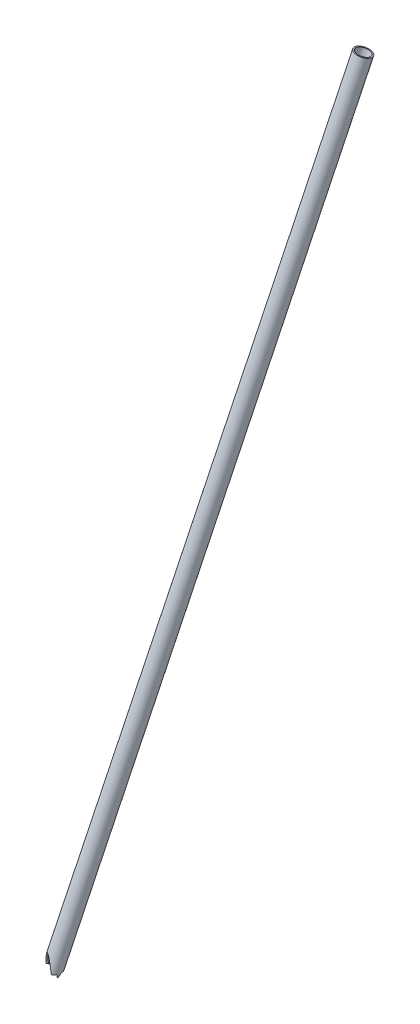
ISO-10303-21;
HEADER;
FILE_DESCRIPTION(('STEP AP214'),'2;1');
FILE_NAME('part.step','',(''),(''),'','','');
FILE_SCHEMA(('AUTOMOTIVE_DESIGN { 1 0 10303 214 1 1 1 1 }'));
ENDSEC;
DATA;
#1=APPLICATION_CONTEXT('core data for automotive mechanical design processes');
#2=APPLICATION_PROTOCOL_DEFINITION('international standard','automotive_design',2000,#1);
#3=PRODUCT_CONTEXT('',#1,'mechanical');
#4=PRODUCT('Part','Part','',(#3));
#5=PRODUCT_RELATED_PRODUCT_CATEGORY('part','',(#4));
#6=PRODUCT_DEFINITION_FORMATION('','',#4);
#7=PRODUCT_DEFINITION_CONTEXT('part definition',#1,'design');
#8=PRODUCT_DEFINITION('design','',#6,#7);
#9=PRODUCT_DEFINITION_SHAPE('','',#8);
#10=(LENGTH_UNIT() NAMED_UNIT(*) SI_UNIT(.MILLI.,.METRE.));
#11=(NAMED_UNIT(*) PLANE_ANGLE_UNIT() SI_UNIT($,.RADIAN.));
#12=(NAMED_UNIT(*) SI_UNIT($,.STERADIAN.) SOLID_ANGLE_UNIT());
#13=UNCERTAINTY_MEASURE_WITH_UNIT(LENGTH_MEASURE(1.E-05),#10,'distance_accuracy_value','');
#14=(GEOMETRIC_REPRESENTATION_CONTEXT(3) GLOBAL_UNCERTAINTY_ASSIGNED_CONTEXT((#13)) GLOBAL_UNIT_ASSIGNED_CONTEXT((#10,
#11,#12)) REPRESENTATION_CONTEXT('',''));
#15=CARTESIAN_POINT('',(0.,0.,0.));
#16=DIRECTION('',(0.,0.,1.));
#17=DIRECTION('',(1.,0.,0.));
#18=AXIS2_PLACEMENT_3D('',#15,#16,#17);
#19=CARTESIAN_POINT('',(-115.,920.,-1946.51325703663));
#20=DIRECTION('',(-0.140336447675245,-0.956366902675742,0.256257739239816));
#21=DIRECTION('',(0.,-0.258819045102517,-0.965925826289069));
#22=AXIS2_PLACEMENT_3D('',#19,#20,#21);
#23=CYLINDRICAL_SURFACE('',#22,7.90000000000002);
#24=CARTESIAN_POINT('',(-249.256500167691,3.02214321572415,-1708.9884626593));
#25=CARTESIAN_POINT('',(-249.036182368543,2.99789343579126,-1708.9819641937));
#26=CARTESIAN_POINT('',(-248.815767735897,2.97675560782215,-1708.96663661791));
#27=CARTESIAN_POINT('',(-248.376445132871,2.93978476053923,-1708.91814526736));
#28=CARTESIAN_POINT('',(-248.157537331688,2.92395232772737,-1708.88497952166));
#29=CARTESIAN_POINT('',(-247.722853153401,2.89689185007694,-1708.80081715776));
#30=CARTESIAN_POINT('',(-247.507077210988,2.88566443861308,-1708.74981808854));
#31=CARTESIAN_POINT('',(-247.080300375228,2.86729806210727,-1708.63018172462));
#32=CARTESIAN_POINT('',(-246.869299332165,2.86015896870607,-1708.56154498377));
#33=CARTESIAN_POINT('',(-246.453575175359,2.84960407778626,-1708.4069809152));
#34=CARTESIAN_POINT('',(-246.248853521531,2.84618913982642,-1708.32104960119));
#35=CARTESIAN_POINT('',(-245.847240758612,2.84286020666019,-1708.13244545453));
#36=CARTESIAN_POINT('',(-245.650349705913,2.84294623666123,-1708.02977250134));
#37=CARTESIAN_POINT('',(-245.265852140703,2.84652162345741,-1707.80840680679));
#38=CARTESIAN_POINT('',(-245.078244547217,2.85001058302728,-1707.6897159366));
#39=CARTESIAN_POINT('',(-244.713629373674,2.86041763823783,-1707.43717385897));
#40=CARTESIAN_POINT('',(-244.536621739568,2.86733571639178,-1707.30332272885));
#41=CARTESIAN_POINT('',(-244.195258271046,2.88471198786831,-1707.02215265619));
#42=CARTESIAN_POINT('',(-244.030845965393,2.89515308821804,-1706.87490120189));
#43=CARTESIAN_POINT('',(-243.714839121708,2.91986624017274,-1706.56752946344));
#44=CARTESIAN_POINT('',(-243.563244601543,2.9341382971174,-1706.40740916136));
#45=CARTESIAN_POINT('',(-243.2738061721,2.96694901655685,-1706.07551791642));
#46=CARTESIAN_POINT('',(-243.135966111873,2.98548886857931,-1705.9037437348));
#47=CARTESIAN_POINT('',(-242.874927556081,3.02743547639502,-1705.54997057133));
#48=CARTESIAN_POINT('',(-242.751728993475,3.05084220990213,-1705.36797163629));
#49=CARTESIAN_POINT('',(-242.519964061808,3.10349066174583,-1704.99409917647));
#50=CARTESIAN_POINT('',(-242.411493131731,3.13276765161691,-1704.80217143298));
#51=CARTESIAN_POINT('',(-242.210666993679,3.19813590607184,-1704.4111520395));
#52=CARTESIAN_POINT('',(-242.118312970018,3.23422767101807,-1704.21205986433));
#53=CARTESIAN_POINT('',(-241.950185802955,3.31458205478329,-1703.8086310113));
#54=CARTESIAN_POINT('',(-241.874409525504,3.35884312625967,-1703.6042953329));
#55=CARTESIAN_POINT('',(-241.739707529576,3.45724312845295,-1703.19248395115));
#56=CARTESIAN_POINT('',(-241.6807780382,3.511379843027,-1702.98500896185));
#57=CARTESIAN_POINT('',(-241.590449559976,3.61894948308481,-1702.61312754901));
#58=CARTESIAN_POINT('',(-241.55586717941,3.67013656516434,-1702.44883880261));
#59=CARTESIAN_POINT('',(-241.497162781385,3.78110924871175,-1702.12131096278));
#60=CARTESIAN_POINT('',(-241.473038463262,3.84089295515408,-1701.95807164628));
#61=CARTESIAN_POINT('',(-241.435041548976,3.97017620969921,-1701.63451732155));
#62=CARTESIAN_POINT('',(-241.421154389148,4.03966178749526,-1701.47419847669));
#63=CARTESIAN_POINT('',(-241.40314711994,4.18954635370536,-1701.15814772467));
#64=CARTESIAN_POINT('',(-241.399027011033,4.26994534264877,-1701.00241581772));
#65=CARTESIAN_POINT('',(-241.399877625056,4.44337502078616,-1700.69613874799));
#66=CARTESIAN_POINT('',(-241.404937111209,4.53652090750635,-1700.54565872358));
#67=CARTESIAN_POINT('',(-241.423324234261,4.73523200279209,-1700.25366953359));
#68=CARTESIAN_POINT('',(-241.436651066904,4.84079600250294,-1700.11215949688));
#69=CARTESIAN_POINT('',(-241.470299209221,5.06398101449252,-1699.84008663402));
#70=CARTESIAN_POINT('',(-241.490614616246,5.18159179321447,-1699.70951468478));
#71=CARTESIAN_POINT('',(-241.536843133782,5.42797301408138,-1699.46046079797));
#72=CARTESIAN_POINT('',(-241.562756777007,5.55674451755599,-1699.34198001255));
#73=CARTESIAN_POINT('',(-241.621059823732,5.83469578628377,-1699.10861293939));
#74=CARTESIAN_POINT('',(-241.65380230337,5.98468398447886,-1698.99478089026));
#75=CARTESIAN_POINT('',(-241.722725224552,6.29378628569482,-1698.78151224901));
#76=CARTESIAN_POINT('',(-241.758906306688,6.45290208694095,-1698.68207834794));
#77=CARTESIAN_POINT('',(-241.833692474529,6.77867119623817,-1698.496280374));
#78=CARTESIAN_POINT('',(-241.872304818595,6.94534661431653,-1698.40995834398));
#79=CARTESIAN_POINT('',(-241.951079622221,7.28398108272755,-1698.24934360821));
#80=CARTESIAN_POINT('',(-241.991242058479,7.45594005362872,-1698.17505072171));
#81=CARTESIAN_POINT('',(-242.080799202229,7.8385809559047,-1698.02316023484));
#82=CARTESIAN_POINT('',(-242.130432091314,8.0501213108117,-1697.94788026391));
#83=CARTESIAN_POINT('',(-242.230854701619,8.47708469732309,-1697.81005577147));
#84=CARTESIAN_POINT('',(-242.281644921523,8.6925093939828,-1697.74751685994));
#85=CARTESIAN_POINT('',(-242.384317362741,9.12627815427094,-1697.63307727722));
#86=CARTESIAN_POINT('',(-242.436201247676,9.3446264485854,-1697.5811943305));
#87=CARTESIAN_POINT('',(-242.540995575864,9.78298755247793,-1697.48653901069));
#88=CARTESIAN_POINT('',(-242.593905873012,10.003000122473,-1697.44376535116));
#89=CARTESIAN_POINT('',(-242.701158024382,10.4452871597607,-1697.36578789982));
#90=CARTESIAN_POINT('',(-242.755506031377,10.6675674299809,-1697.33062590876));
#91=CARTESIAN_POINT('',(-242.865519610578,11.1127691614014,-1697.26710707695));
#92=CARTESIAN_POINT('',(-242.921185213425,11.3356906374067,-1697.23875039462));
#93=CARTESIAN_POINT('',(-243.0339633881,11.7816177144761,-1697.18804201342));
#94=CARTESIAN_POINT('',(-243.091074542474,12.0046230368509,-1697.16568466378));
#95=CARTESIAN_POINT('',(-243.206992399234,12.4506659997956,-1697.12630127344));
#96=CARTESIAN_POINT('',(-243.265799156572,12.6737036411793,-1697.10927540575));
#97=CARTESIAN_POINT('',(-243.408831950423,13.207331930987,-1697.07430544261));
#98=CARTESIAN_POINT('',(-243.493953345948,13.5178333159976,-1697.05863715983));
#99=CARTESIAN_POINT('',(-243.668468964375,14.1379512700947,-1697.03570983979));
#100=CARTESIAN_POINT('',(-243.757863376828,14.4475677992819,-1697.02845117594));
#101=CARTESIAN_POINT('',(-243.941609470754,15.0656529366436,-1697.02171482522));
#102=CARTESIAN_POINT('',(-244.035964641444,15.3741205689078,-1697.02224269009));
#103=CARTESIAN_POINT('',(-244.230250880927,15.989186125193,-1697.03072868834));
#104=CARTESIAN_POINT('',(-244.330181801736,16.2957840985962,-1697.03868662462));
#105=CARTESIAN_POINT('',(-244.536190650958,16.9059901128803,-1697.06187558185));
#106=CARTESIAN_POINT('',(-244.64225657656,17.2096027173872,-1697.07709279692));
#107=CARTESIAN_POINT('',(-244.861591374517,17.8137862007953,-1697.11487140516));
#108=CARTESIAN_POINT('',(-244.974860687429,18.1143568923489,-1697.13743324788));
#109=CARTESIAN_POINT('',(-245.209531391689,18.7113294243591,-1697.1901655131));
#110=CARTESIAN_POINT('',(-245.330925227015,19.0077348364932,-1697.22032893621));
#111=CARTESIAN_POINT('',(-245.583180717784,19.5954991343367,-1697.28879327269));
#112=CARTESIAN_POINT('',(-245.714040705626,19.8868588977561,-1697.32709275507));
#113=CARTESIAN_POINT('',(-245.987650718913,20.4648033713131,-1697.41290211955));
#114=CARTESIAN_POINT('',(-246.130467787396,20.7513486098981,-1697.46046623625));
#115=CARTESIAN_POINT('',(-246.429419629168,21.315726757386,-1697.56588373294));
#116=CARTESIAN_POINT('',(-246.58556168184,21.5935547893028,-1697.62374275597));
#117=CARTESIAN_POINT('',(-246.912884534486,22.1355235546812,-1697.75111094874));
#118=CARTESIAN_POINT('',(-247.08397883148,22.3997305705936,-1697.82055497707));
#119=CARTESIAN_POINT('',(-247.354775357769,22.7826134965024,-1697.9353300021));
#120=CARTESIAN_POINT('',(-247.447347724634,22.9079409097376,-1697.97533272089));
#121=CARTESIAN_POINT('',(-247.637734762296,23.1531638450348,-1698.05926241126));
#122=CARTESIAN_POINT('',(-247.735548621012,23.2730602032663,-1698.10318877563));
#123=CARTESIAN_POINT('',(-247.980662409145,23.5567875648039,-1698.21540026042));
#124=CARTESIAN_POINT('',(-248.131029449122,23.7171267554309,-1698.28598872214));
#125=CARTESIAN_POINT('',(-248.445307387448,24.0191196506905,-1698.43755745943));
#126=CARTESIAN_POINT('',(-248.609233066051,24.1607525151188,-1698.51854913013));
#127=CARTESIAN_POINT('',(-248.953733120166,24.4191774393142,-1698.69334129884));
#128=CARTESIAN_POINT('',(-249.134484528381,24.5356491160029,-1698.78728456973));
#129=CARTESIAN_POINT('',(-249.415329890532,24.6818171713065,-1698.93718476968));
#130=CARTESIAN_POINT('',(-249.510488217141,24.7257605460536,-1698.98860628786));
#131=CARTESIAN_POINT('',(-249.703550646618,24.8027966775075,-1699.09428625482));
#132=CARTESIAN_POINT('',(-249.801453538039,24.8358941422055,-1699.14854346079));
#133=CARTESIAN_POINT('',(-250.046974623868,24.902935006471,-1699.28637510728));
#134=CARTESIAN_POINT('',(-250.195820994628,24.9296041789778,-1699.37148065472));
#135=CARTESIAN_POINT('',(-250.493795309004,24.9532906494563,-1699.54511248947));
#136=CARTESIAN_POINT('',(-250.642923060142,24.9503237519992,-1699.63363692844));
#137=CARTESIAN_POINT('',(-250.936861190887,24.9150024438784,-1699.81135864404));
#138=CARTESIAN_POINT('',(-251.081677850027,24.8826931785731,-1699.90055467836));
#139=CARTESIAN_POINT('',(-251.363785609803,24.791825648547,-1700.07740235406));
#140=CARTESIAN_POINT('',(-251.50106968425,24.7332433289742,-1700.16505250346));
#141=CARTESIAN_POINT('',(-251.825442154058,24.5632566965637,-1700.37569692124));
#142=CARTESIAN_POINT('',(-252.007357943612,24.4399461996597,-1700.49697404211));
#143=CARTESIAN_POINT('',(-252.350667075325,24.1610671474915,-1700.73119658227));
#144=CARTESIAN_POINT('',(-252.512002896176,24.0054112423814,-1700.84411829395));
#145=CARTESIAN_POINT('',(-252.798187360464,23.6913837277498,-1701.04899421027));
#146=CARTESIAN_POINT('',(-252.925097241603,23.5354348982896,-1701.1418593753));
#147=CARTESIAN_POINT('',(-253.166150079783,23.2107437882489,-1701.32181789863));
#148=CARTESIAN_POINT('',(-253.280282271771,23.0419909182378,-1701.40890636531));
#149=CARTESIAN_POINT('',(-253.49755148877,22.6947102126354,-1701.57809903037));
#150=CARTESIAN_POINT('',(-253.600666259305,22.5161636550754,-1701.66019300143));
#151=CARTESIAN_POINT('',(-253.797049027373,22.1519077444489,-1701.81985495894));
#152=CARTESIAN_POINT('',(-253.890319768455,21.966200406911,-1701.89742420374));
#153=CARTESIAN_POINT('',(-254.079213226861,21.565905895567,-1702.05798889814));
#154=CARTESIAN_POINT('',(-254.173705355939,21.3505832595807,-1702.14047239511));
#155=CARTESIAN_POINT('',(-254.353159855995,20.914435970673,-1702.30124124269));
#156=CARTESIAN_POINT('',(-254.438119824685,20.6936099478533,-1702.37952553245));
#157=CARTESIAN_POINT('',(-254.599615264983,20.2474539192527,-1702.53255438143));
#158=CARTESIAN_POINT('',(-254.676142794258,20.0221198995154,-1702.60729556636));
#159=CARTESIAN_POINT('',(-254.821524052568,19.5679828002755,-1702.75369070078));
#160=CARTESIAN_POINT('',(-254.890376870354,19.3391793124852,-1702.82534428306));
#161=CARTESIAN_POINT('',(-255.021265617972,18.8780418228057,-1702.96623728698));
#162=CARTESIAN_POINT('',(-255.08327900444,18.645698859312,-1703.03546823996));
#163=CARTESIAN_POINT('',(-255.200747386825,18.1787028802374,-1703.17168668767));
#164=CARTESIAN_POINT('',(-255.256201890132,17.9440496925765,-1703.23867401362));
#165=CARTESIAN_POINT('',(-255.41328164486,17.2375677800415,-1703.43675094707));
#166=CARTESIAN_POINT('',(-255.505716104982,16.7628834406379,-1703.56505583188));
#167=CARTESIAN_POINT('',(-255.636494899728,15.9937482560146,-1703.76809335217));
#168=CARTESIAN_POINT('',(-255.681909400966,15.7008420754112,-1703.8442929738));
#169=CARTESIAN_POINT('',(-255.764442965085,15.1135580097153,-1703.99558349483));
#170=CARTESIAN_POINT('',(-255.801561780366,14.8191800809638,-1704.07067436108));
#171=CARTESIAN_POINT('',(-255.867520744257,14.2291600629448,-1704.22046899068));
#172=CARTESIAN_POINT('',(-255.896354518232,13.9335171769472,-1704.29517241276));
#173=CARTESIAN_POINT('',(-255.945475642116,13.3416005795638,-1704.44486983557));
#174=CARTESIAN_POINT('',(-255.965763243098,13.0453268869673,-1704.5198638277));
#175=CARTESIAN_POINT('',(-255.997243648787,12.453812026197,-1704.67067336998));
#176=CARTESIAN_POINT('',(-256.008473856688,12.15857167709,-1704.7464842176));
#177=CARTESIAN_POINT('',(-256.021182333193,11.5683832019166,-1704.90022210189));
#178=CARTESIAN_POINT('',(-256.022659549982,11.2734351107983,-1704.9781493659));
#179=CARTESIAN_POINT('',(-256.014638249768,10.6849001040318,-1705.1372038165));
#180=CARTESIAN_POINT('',(-256.005152442251,10.3913120075605,-1705.21832719261));
#181=CARTESIAN_POINT('',(-255.973434050097,9.80620473375194,-1705.38527558771));
#182=CARTESIAN_POINT('',(-255.95120534303,9.51468495434765,-1705.47109916928));
#183=CARTESIAN_POINT('',(-255.900722721976,9.02574174501639,-1705.62136808631));
#184=CARTESIAN_POINT('',(-255.87652205362,8.82738014871572,-1705.6841135684));
#185=CARTESIAN_POINT('',(-255.819693364121,8.43303917636189,-1705.81330368769));
#186=CARTESIAN_POINT('',(-255.787064802761,8.23705995385908,-1705.87974856181));
#187=CARTESIAN_POINT('',(-255.711964033271,7.84853559585309,-1706.01698123338));
#188=CARTESIAN_POINT('',(-255.669493206112,7.65598998265699,-1706.08776842055));
#189=CARTESIAN_POINT('',(-255.572976470224,7.27571369825873,-1706.23430035572));
#190=CARTESIAN_POINT('',(-255.518932327912,7.08798229716123,-1706.31004434596));
#191=CARTESIAN_POINT('',(-255.407368332326,6.74978563075676,-1706.45388981457));
#192=CARTESIAN_POINT('',(-255.3519083931,6.59829995941508,-1706.52117788995));
#193=CARTESIAN_POINT('',(-255.230349720868,6.30138552017458,-1706.65948249007));
#194=CARTESIAN_POINT('',(-255.164251830137,6.15595627389617,-1706.73049871934));
#195=CARTESIAN_POINT('',(-255.0204674174,5.87304859834962,-1706.87577357907));
#196=CARTESIAN_POINT('',(-254.942805247756,5.73555428407183,-1706.95002516941));
#197=CARTESIAN_POINT('',(-254.775005939588,5.46988049561137,-1707.10110997804));
#198=CARTESIAN_POINT('',(-254.684869709331,5.34170034427706,-1707.17794300807));
#199=CARTESIAN_POINT('',(-254.490873171825,5.09494862604585,-1707.33367330768));
#200=CARTESIAN_POINT('',(-254.386885998006,4.97648457666789,-1707.41258347521));
#201=CARTESIAN_POINT('',(-254.16622746845,4.75169278512982,-1707.56997442586));
#202=CARTESIAN_POINT('',(-254.049555715141,4.64536542358324,-1707.64845519544));
#203=CARTESIAN_POINT('',(-253.80432441533,4.44515388490445,-1707.80310926281));
#204=CARTESIAN_POINT('',(-253.675751019017,4.35128452202188,-1707.8792797318));
#205=CARTESIAN_POINT('',(-253.408165417238,4.17585266388438,-1708.0272901158));
#206=CARTESIAN_POINT('',(-253.269153060411,4.09429034712903,-1708.099129968));
#207=CARTESIAN_POINT('',(-253.000750024563,3.95245226610181,-1708.22788434747));
#208=CARTESIAN_POINT('',(-252.872435273046,3.89078778139107,-1708.28552822829));
#209=CARTESIAN_POINT('',(-252.609971462167,3.77540259853632,-1708.39534047601));
#210=CARTESIAN_POINT('',(-252.475820376005,3.72168468898449,-1708.44750691892));
#211=CARTESIAN_POINT('',(-252.202677846799,3.62141855297264,-1708.54557666263));
#212=CARTESIAN_POINT('',(-252.063687119969,3.57486927111772,-1708.59148088526));
#213=CARTESIAN_POINT('',(-251.781683891459,3.48811975865721,-1708.6764436509));
#214=CARTESIAN_POINT('',(-251.638670852355,3.44792038126071,-1708.71550127404));
#215=CARTESIAN_POINT('',(-251.314187706421,3.36401023639526,-1708.79491179625));
#216=CARTESIAN_POINT('',(-251.131829954304,3.32182645563784,-1708.83326593718));
#217=CARTESIAN_POINT('',(-250.763465256512,3.24481797981445,-1708.89796161738));
#218=CARTESIAN_POINT('',(-250.577457884128,3.20999415093702,-1708.92430174314));
#219=CARTESIAN_POINT('',(-250.202925006779,3.14659406843854,-1708.96448308532));
#220=CARTESIAN_POINT('',(-250.014397995699,3.11802174675867,-1708.97831645254));
#221=CARTESIAN_POINT('',(-249.636104727693,3.06624364250331,-1708.99310636008));
#222=CARTESIAN_POINT('',(-249.446338394787,3.04303819219781,-1708.99406210335));
#223=CARTESIAN_POINT('',(-249.256500167691,3.02214321572415,-1708.9884626593));
#224=B_SPLINE_CURVE_WITH_KNOTS('',3,(#24,#25,#26,#27,#28,#29,#30,#31,#32,#33,#34,#35,#36,#37,
#38,#39,#40,#41,#42,#43,#44,#45,#46,#47,#48,#49,#50,#51,#52,#53,#54,#55,#56,#57,#58,#59,#60,#61,
#62,#63,#64,#65,#66,#67,#68,#69,#70,#71,#72,#73,#74,#75,#76,#77,#78,#79,#80,#81,#82,#83,#84,#85,
#86,#87,#88,#89,#90,#91,#92,#93,#94,#95,#96,#97,#98,#99,#100,#101,#102,#103,#104,#105,#106,#107,
#108,#109,#110,#111,#112,#113,#114,#115,#116,#117,#118,#119,#120,#121,#122,#123,#124,#125,#126,
#127,#128,#129,#130,#131,#132,#133,#134,#135,#136,#137,#138,#139,#140,#141,#142,#143,#144,#145,
#146,#147,#148,#149,#150,#151,#152,#153,#154,#155,#156,#157,#158,#159,#160,#161,#162,#163,#164,
#165,#166,#167,#168,#169,#170,#171,#172,#173,#174,#175,#176,#177,#178,#179,#180,#181,#182,#183,
#184,#185,#186,#187,#188,#189,#190,#191,#192,#193,#194,#195,#196,#197,#198,#199,#200,#201,#202,
#203,#204,#205,#206,#207,#208,#209,#210,#211,#212,#213,#214,#215,#216,#217,#218,#219,#220,#221,
#222,#223),.UNSPECIFIED.,.T.,.F.,(4,2,2,2,2,2,2,2,2,2,2,2,2,2,2,2,2,2,2,2,2,2,2,2,2,2,2,2,2,2,2,
2,2,2,2,2,2,2,2,2,2,2,2,2,2,2,2,2,2,2,2,2,2,2,2,2,2,2,2,2,2,2,2,2,2,2,2,2,2,2,2,2,2,2,2,2,2,2,2,
2,2,2,2,2,2,2,2,2,2,2,2,2,2,2,2,2,2,2,2,4),(0.,0.665060874043606,1.33019524514149,
1.99542106817759,2.66062600424473,3.3259844413705,3.99134766916504,4.65663323814874,
5.32191541455638,5.9840151152816,6.64611573886306,7.30840112826697,7.97068348503729,
8.63707132155515,9.30350810542022,9.96981878925993,10.6359801332343,11.1620599726297,
11.6880240211366,12.2132383668953,12.73845273813,13.2687728273552,13.7990413346495,
14.328863064994,14.8587352341575,15.4311942013619,16.0037600243725,16.5781246738802,
17.1524806927673,17.8418569115511,18.5315360142338,19.2223531574721,19.9130726772461,
20.60749422991,21.3019319472575,21.9957132606707,22.6895170841713,23.656377824996,
24.6232814958108,25.5908745951429,26.5584420264258,27.5241766029647,28.489970300297,
29.4548779409064,30.4196160110028,31.3901812107528,32.3612800627604,33.3270919953046,
33.8094915755538,34.2918166309848,34.983280121289,35.6755075684952,36.3760882608629,
36.7258438859966,37.0754474875202,37.593477074836,38.111230417757,38.6281885067218,
39.1456208769647,39.8943777506257,40.6451835754576,41.3086400138806,41.9726512658684,
42.6379793832178,43.3031215799074,44.0503595818313,44.7977854809613,45.5459094530794,
46.2941221585517,47.044731646816,47.7953974746192,49.2956498477126,50.2136896336418,
51.1317568164633,52.050528493977,52.9692731775357,53.8842041244706,54.7992337408516,
55.713203622369,56.6268955371724,57.2550772479012,57.8832992342098,58.5114331277899,
59.1394712184622,59.6634396888425,60.1873666936582,60.7102056066196,61.2330064704091,
61.7609757273054,62.2889615370748,62.8175696730694,63.3461854751815,63.8065329667238,
64.2670416209829,64.727482412313,65.1879850185428,65.7605769653545,66.3332362627075,
66.9062547103974,67.4793086249131),.UNSPECIFIED.);
#225=CARTESIAN_POINT('',(-242.593324865931,10.,-1697.44569111524));
#226=VERTEX_POINT('',#225);
#227=CARTESIAN_POINT('',(-255.983691368394,10.,-1705.3300830909));
#228=VERTEX_POINT('',#227);
#229=EDGE_CURVE('E106',#226,#228,#224,.T.);
#230=ORIENTED_EDGE('',*,*,#229,.T.);
#231=CARTESIAN_POINT('',(-248.532608695652,10.,-1702.67949192431));
#232=DIRECTION('',(0.,-1.,0.));
#233=DIRECTION('',(-0.480327336741099,0.,0.87708930536132));
#234=AXIS2_PLACEMENT_3D('',#231,#232,#233);
#235=ELLIPSE('',#234,8.26042806154965,7.90000000000002);
#236=EDGE_CURVE('E114',#228,#226,#235,.T.);
#237=ORIENTED_EDGE('',*,*,#236,.T.);
#238=EDGE_LOOP('',(#230,#237));
#239=FACE_BOUND('',#238,.T.);
#240=CARTESIAN_POINT('',(-115.,920.,-1946.51325703663));
#241=DIRECTION('',(0.140336447675245,0.956366902675757,-0.25625773923976));
#242=DIRECTION('',(0.,0.258819045102461,0.965925826289084));
#243=AXIS2_PLACEMENT_3D('',#240,#241,#242);
#244=CIRCLE('',#243,7.90000000000002);
#245=CARTESIAN_POINT('',(-115.,922.044670456309,-1938.88244300895));
#246=VERTEX_POINT('',#245);
#247=EDGE_CURVE('E45',#246,#246,#244,.T.);
#248=ORIENTED_EDGE('',*,*,#247,.T.);
#249=EDGE_LOOP('',(#248));
#250=FACE_BOUND('',#249,.T.);
#251=ADVANCED_FACE('F41',(#239,#250),#23,.F.);
#252=CARTESIAN_POINT('',(-115.,920.,-1946.51325703663));
#253=DIRECTION('',(-0.140336447675245,-0.956366902675742,0.256257739239816));
#254=DIRECTION('',(0.,-0.258819045102517,-0.965925826289069));
#255=AXIS2_PLACEMENT_3D('',#252,#253,#254);
#256=CYLINDRICAL_SURFACE('',#255,9.49999999999999);
#257=CARTESIAN_POINT('',(-248.532608695652,10.,-1702.67949192431));
#258=DIRECTION('',(0.,-1.,0.));
#259=DIRECTION('',(-0.480327336741099,0.,0.87708930536132));
#260=AXIS2_PLACEMENT_3D('',#257,#258,#259);
#261=ELLIPSE('',#260,9.93342614996473,9.49999999999999);
#262=CARTESIAN_POINT('',(-239.809985624827,10.,-1698.90694898628));
#263=VERTEX_POINT('',#262);
#264=CARTESIAN_POINT('',(-242.78224015655,10.,-1695.0300997733));
#265=VERTEX_POINT('',#264);
#266=EDGE_CURVE('E51',#263,#265,#261,.T.);
#267=ORIENTED_EDGE('',*,*,#266,.F.);
#268=CARTESIAN_POINT('',(-241.672714271624,56.7489101489333,-1715.20582464575));
#269=DIRECTION('',(-0.993532672656404,0.,0.113546591160732));
#270=DIRECTION('',(0.0274929033858099,-0.970244108037456,0.240562904625837));
#271=AXIS2_PLACEMENT_3D('',#268,#269,#270);
#272=ELLIPSE('',#271,56.3711108055408,9.49999999999999);
#273=CARTESIAN_POINT('',(-239.858774037238,6.12393332948732,-1699.33384759487));
#274=VERTEX_POINT('',#273);
#275=EDGE_CURVE('E78',#274,#263,#272,.T.);
#276=ORIENTED_EDGE('',*,*,#275,.F.);
#277=CARTESIAN_POINT('',(-231.034262268948,129.247990463464,-1734.63189466803));
#278=DIRECTION('',(-0.970142500145332,0.,-0.242535625036333));
#279=DIRECTION('',(-0.0687394638953399,-0.958995862221252,0.274957855581359));
#280=AXIS2_PLACEMENT_3D('',#277,#278,#279);
#281=ELLIPSE('',#280,128.387536830015,9.49999999999999);
#282=CARTESIAN_POINT('',(-238.930875304719,10.,-1703.04544252495));
#283=VERTEX_POINT('',#282);
#284=EDGE_CURVE('E85',#283,#274,#281,.T.);
#285=ORIENTED_EDGE('',*,*,#284,.F.);
#286=CARTESIAN_POINT('',(-257.987111759544,10.,-1704.0301053193));
#287=VERTEX_POINT('',#286);
#288=EDGE_CURVE('E91',#287,#283,#261,.T.);
#289=ORIENTED_EDGE('',*,*,#288,.F.);
#290=CARTESIAN_POINT('',(-250.,0.,-1700.));
#291=DIRECTION('',(-0.508456010272344,-0.0599232902931692,0.859000398660194));
#292=DIRECTION('',(0.0394871934442316,-0.998148808069163,-0.0462570913915509));
#293=AXIS2_PLACEMENT_3D('',#290,#291,#292);
#294=ELLIPSE('',#293,27.2370926599014,9.49999999999999);
#295=EDGE_CURVE('E115',#265,#287,#294,.T.);
#296=ORIENTED_EDGE('',*,*,#295,.F.);
#297=EDGE_LOOP('',(#267,#276,#285,#289,#296));
#298=FACE_BOUND('',#297,.T.);
#299=CARTESIAN_POINT('',(-115.,920.,-1946.51325703663));
#300=DIRECTION('',(0.140336447675245,0.956366902675757,-0.25625773923976));
#301=DIRECTION('',(0.,0.258819045102461,0.965925826289084));
#302=AXIS2_PLACEMENT_3D('',#299,#300,#301);
#303=CIRCLE('',#302,9.49999999999999);
#304=CARTESIAN_POINT('',(-115.,922.458780928473,-1937.33696168688));
#305=VERTEX_POINT('',#304);
#306=EDGE_CURVE('E11',#305,#305,#303,.T.);
#307=ORIENTED_EDGE('',*,*,#306,.F.);
#308=EDGE_LOOP('',(#307));
#309=FACE_BOUND('',#308,.T.);
#310=ADVANCED_FACE('F97',(#298,#309),#256,.T.);
#311=CARTESIAN_POINT('',(-250.,0.,-1700.));
#312=DIRECTION('',(-0.214351342090107,0.914565726251124,0.342962147344171));
#313=DIRECTION('',(0.,-0.351123441588391,0.936329177569045));
#314=AXIS2_PLACEMENT_3D('',#311,#312,#313);
#315=CYLINDRICAL_SURFACE('',#314,9.49999999999999);
#316=ORIENTED_EDGE('',*,*,#295,.T.);
#317=CARTESIAN_POINT('',(-252.34375,10.,-1696.25));
#318=DIRECTION('',(0.,-1.,0.));
#319=DIRECTION('',(-0.52999894000318,0.,0.847998304005088));
#320=AXIS2_PLACEMENT_3D('',#317,#318,#319);
#321=ELLIPSE('',#320,10.3874437094218,9.49999999999999);
#322=EDGE_CURVE('E60',#287,#228,#321,.T.);
#323=ORIENTED_EDGE('',*,*,#322,.T.);
#324=ORIENTED_EDGE('',*,*,#229,.F.);
#325=EDGE_CURVE('E101',#226,#265,#321,.T.);
#326=ORIENTED_EDGE('',*,*,#325,.T.);
#327=EDGE_LOOP('',(#316,#323,#324,#326));
#328=FACE_BOUND('',#327,.T.);
#329=ADVANCED_FACE('F119',(#328),#315,.F.);
#330=CARTESIAN_POINT('',(-240.064673273436,-10.,-1701.13546591161));
#331=DIRECTION('',(-0.993532672656404,0.,0.113546591160732));
#332=DIRECTION('',(0.113546591160732,0.,0.993532672656404));
#333=AXIS2_PLACEMENT_3D('',#330,#331,#332);
#334=PLANE('',#333);
#335=ORIENTED_EDGE('',*,*,#275,.T.);
#336=DIRECTION('',(0.113546591160732,0.,0.993532672656404));
#337=VECTOR('',#336,1.);
#338=CARTESIAN_POINT('',(-240.064673273436,10.,-1701.13546591161));
#339=LINE('',#338,#337);
#340=CARTESIAN_POINT('',(-239.858774037238,10.,-1699.33384759487));
#341=VERTEX_POINT('',#340);
#342=EDGE_CURVE('E94',#341,#263,#339,.T.);
#343=ORIENTED_EDGE('',*,*,#342,.F.);
#344=DIRECTION('',(0.,-1.,0.));
#345=VECTOR('',#344,1.);
#346=CARTESIAN_POINT('',(-239.858774037238,-10.,-1699.33384759487));
#347=LINE('',#346,#345);
#348=EDGE_CURVE('E87',#341,#274,#347,.T.);
#349=ORIENTED_EDGE('',*,*,#348,.T.);
#350=EDGE_LOOP('',(#335,#343,#349));
#351=FACE_BOUND('',#350,.T.);
#352=ADVANCED_FACE('F93',(#351),#334,.T.);
#353=CARTESIAN_POINT('',(-165.298574998547,-10.,-1997.57464374964));
#354=DIRECTION('',(-0.970142500145332,0.,-0.242535625036333));
#355=DIRECTION('',(-0.242535625036333,0.,0.970142500145332));
#356=AXIS2_PLACEMENT_3D('',#353,#354,#355);
#357=PLANE('',#356);
#358=ORIENTED_EDGE('',*,*,#284,.T.);
#359=ORIENTED_EDGE('',*,*,#348,.F.);
#360=DIRECTION('',(-0.242535625036333,0.,0.970142500145332));
#361=VECTOR('',#360,1.);
#362=CARTESIAN_POINT('',(-165.298574998547,10.,-1997.57464374964));
#363=LINE('',#362,#361);
#364=EDGE_CURVE('E89',#283,#341,#363,.T.);
#365=ORIENTED_EDGE('',*,*,#364,.F.);
#366=EDGE_LOOP('',(#358,#359,#365));
#367=FACE_BOUND('',#366,.T.);
#368=ADVANCED_FACE('F86',(#367),#357,.T.);
#369=CARTESIAN_POINT('',(259.935326726564,10.,-1698.86453408839));
#370=DIRECTION('',(0.,-1.,0.));
#371=DIRECTION('',(0.,0.,-1.));
#372=AXIS2_PLACEMENT_3D('',#369,#370,#371);
#373=PLANE('',#372);
#374=ORIENTED_EDGE('',*,*,#288,.T.);
#375=ORIENTED_EDGE('',*,*,#364,.T.);
#376=ORIENTED_EDGE('',*,*,#342,.T.);
#377=ORIENTED_EDGE('',*,*,#266,.T.);
#378=ORIENTED_EDGE('',*,*,#325,.F.);
#379=ORIENTED_EDGE('',*,*,#236,.F.);
#380=ORIENTED_EDGE('',*,*,#322,.F.);
#381=EDGE_LOOP('',(#374,#375,#376,#377,#378,#379,#380));
#382=FACE_BOUND('',#381,.T.);
#383=ADVANCED_FACE('F124',(#382),#373,.T.);
#384=CARTESIAN_POINT('',(-115.,920.,-1946.51325703663));
#385=DIRECTION('',(0.140336447675245,0.956366902675757,-0.25625773923976));
#386=DIRECTION('',(0.,0.258819045102461,0.965925826289084));
#387=AXIS2_PLACEMENT_3D('',#384,#385,#386);
#388=PLANE('',#387);
#389=ORIENTED_EDGE('',*,*,#247,.F.);
#390=EDGE_LOOP('',(#389));
#391=FACE_BOUND('',#390,.T.);
#392=ORIENTED_EDGE('',*,*,#306,.T.);
#393=EDGE_LOOP('',(#392));
#394=FACE_BOUND('',#393,.T.);
#395=ADVANCED_FACE('F43',(#391,#394),#388,.T.);
#396=CLOSED_SHELL('',(#251,#310,#329,#352,#368,#383,#395));
#397=MANIFOLD_SOLID_BREP('B2',#396);
#398=ADVANCED_BREP_SHAPE_REPRESENTATION('',(#18,#397),#14);
#399=SHAPE_DEFINITION_REPRESENTATION(#9,#398);
ENDSEC;
END-ISO-10303-21;
